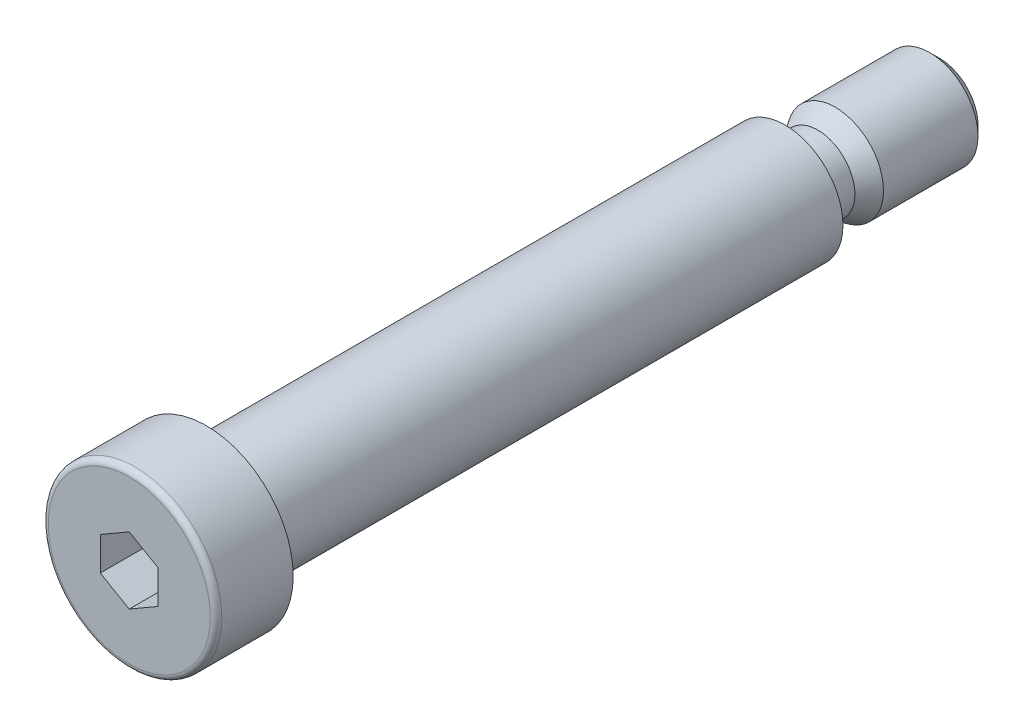
ISO-10303-21;
HEADER;
FILE_DESCRIPTION(('STEP AP214'),'2;1');
FILE_NAME('part.step','',(''),(''),'','','');
FILE_SCHEMA(('AUTOMOTIVE_DESIGN { 1 0 10303 214 1 1 1 1 }'));
ENDSEC;
DATA;
#1=APPLICATION_CONTEXT('core data for automotive mechanical design processes');
#2=APPLICATION_PROTOCOL_DEFINITION('international standard','automotive_design',2000,#1);
#3=PRODUCT_CONTEXT('',#1,'mechanical');
#4=PRODUCT('Part','Part','',(#3));
#5=PRODUCT_RELATED_PRODUCT_CATEGORY('part','',(#4));
#6=PRODUCT_DEFINITION_FORMATION('','',#4);
#7=PRODUCT_DEFINITION_CONTEXT('part definition',#1,'design');
#8=PRODUCT_DEFINITION('design','',#6,#7);
#9=PRODUCT_DEFINITION_SHAPE('','',#8);
#10=(LENGTH_UNIT() NAMED_UNIT(*) SI_UNIT(.MILLI.,.METRE.));
#11=(NAMED_UNIT(*) PLANE_ANGLE_UNIT() SI_UNIT($,.RADIAN.));
#12=(NAMED_UNIT(*) SI_UNIT($,.STERADIAN.) SOLID_ANGLE_UNIT());
#13=UNCERTAINTY_MEASURE_WITH_UNIT(LENGTH_MEASURE(1.E-05),#10,'distance_accuracy_value','');
#14=(GEOMETRIC_REPRESENTATION_CONTEXT(3) GLOBAL_UNCERTAINTY_ASSIGNED_CONTEXT((#13)) GLOBAL_UNIT_ASSIGNED_CONTEXT((#10,
#11,#12)) REPRESENTATION_CONTEXT('',''));
#15=CARTESIAN_POINT('',(0.,0.,0.));
#16=DIRECTION('',(0.,0.,1.));
#17=DIRECTION('',(1.,0.,0.));
#18=AXIS2_PLACEMENT_3D('',#15,#16,#17);
#19=CARTESIAN_POINT('',(0.,0.,38.));
#20=DIRECTION('',(0.,0.,1.));
#21=DIRECTION('',(1.,0.,0.));
#22=AXIS2_PLACEMENT_3D('',#19,#20,#21);
#23=PLANE('',#22);
#24=CARTESIAN_POINT('',(0.,0.,38.));
#25=DIRECTION('',(0.,0.,1.));
#26=DIRECTION('',(1.,0.,0.));
#27=AXIS2_PLACEMENT_3D('',#24,#25,#26);
#28=CIRCLE('',#27,8.4);
#29=CARTESIAN_POINT('',(8.4,0.,38.));
#30=VERTEX_POINT('',#29);
#31=EDGE_CURVE('E42',#30,#30,#28,.T.);
#32=ORIENTED_EDGE('',*,*,#31,.T.);
#33=EDGE_LOOP('',(#32));
#34=FACE_BOUND('',#33,.T.);
#35=DIRECTION('',(0.,1.,0.));
#36=VECTOR('',#35,1.);
#37=CARTESIAN_POINT('',(3.,-1.73205080756888,38.));
#38=LINE('',#37,#36);
#39=CARTESIAN_POINT('',(3.,-1.73205080756888,38.));
#40=VERTEX_POINT('',#39);
#41=CARTESIAN_POINT('',(3.,1.73205080756888,38.));
#42=VERTEX_POINT('',#41);
#43=EDGE_CURVE('E49',#40,#42,#38,.T.);
#44=ORIENTED_EDGE('',*,*,#43,.F.);
#45=DIRECTION('',(0.866025403784439,0.5,0.));
#46=VECTOR('',#45,1.);
#47=CARTESIAN_POINT('',(0.,-3.46410161513775,38.));
#48=LINE('',#47,#46);
#49=CARTESIAN_POINT('',(0.,-3.46410161513775,38.));
#50=VERTEX_POINT('',#49);
#51=EDGE_CURVE('E132',#50,#40,#48,.T.);
#52=ORIENTED_EDGE('',*,*,#51,.F.);
#53=DIRECTION('',(0.866025403784439,-0.5,0.));
#54=VECTOR('',#53,1.);
#55=CARTESIAN_POINT('',(-3.,-1.73205080756888,38.));
#56=LINE('',#55,#54);
#57=CARTESIAN_POINT('',(-3.,-1.73205080756888,38.));
#58=VERTEX_POINT('',#57);
#59=EDGE_CURVE('E130',#58,#50,#56,.T.);
#60=ORIENTED_EDGE('',*,*,#59,.F.);
#61=DIRECTION('',(0.,-1.,0.));
#62=VECTOR('',#61,1.);
#63=CARTESIAN_POINT('',(-3.,1.73205080756888,38.));
#64=LINE('',#63,#62);
#65=CARTESIAN_POINT('',(-3.,1.73205080756888,38.));
#66=VERTEX_POINT('',#65);
#67=EDGE_CURVE('E97',#66,#58,#64,.T.);
#68=ORIENTED_EDGE('',*,*,#67,.F.);
#69=DIRECTION('',(-0.866025403784439,-0.5,0.));
#70=VECTOR('',#69,1.);
#71=CARTESIAN_POINT('',(0.,3.46410161513775,38.));
#72=LINE('',#71,#70);
#73=CARTESIAN_POINT('',(0.,3.46410161513775,38.));
#74=VERTEX_POINT('',#73);
#75=EDGE_CURVE('E126',#74,#66,#72,.T.);
#76=ORIENTED_EDGE('',*,*,#75,.F.);
#77=DIRECTION('',(-0.866025403784439,0.5,0.));
#78=VECTOR('',#77,1.);
#79=CARTESIAN_POINT('',(3.,1.73205080756888,38.));
#80=LINE('',#79,#78);
#81=EDGE_CURVE('E123',#42,#74,#80,.T.);
#82=ORIENTED_EDGE('',*,*,#81,.F.);
#83=EDGE_LOOP('',(#44,#52,#60,#68,#76,#82));
#84=FACE_BOUND('',#83,.T.);
#85=ADVANCED_FACE('F34',(#34,#84),#23,.T.);
#86=CARTESIAN_POINT('',(0.,0.,-46.));
#87=DIRECTION('',(0.,0.,1.));
#88=DIRECTION('',(1.,0.,0.));
#89=AXIS2_PLACEMENT_3D('',#86,#87,#88);
#90=PLANE('',#89);
#91=CARTESIAN_POINT('',(0.,0.,-46.));
#92=DIRECTION('',(0.,0.,1.));
#93=DIRECTION('',(1.,0.,0.));
#94=AXIS2_PLACEMENT_3D('',#91,#92,#93);
#95=CIRCLE('',#94,4.);
#96=CARTESIAN_POINT('',(4.,0.,-46.));
#97=VERTEX_POINT('',#96);
#98=EDGE_CURVE('E162',#97,#97,#95,.T.);
#99=ORIENTED_EDGE('',*,*,#98,.F.);
#100=EDGE_LOOP('',(#99));
#101=FACE_BOUND('',#100,.T.);
#102=ADVANCED_FACE('F178',(#101),#90,.F.);
#103=CARTESIAN_POINT('',(0.,0.,-46.));
#104=DIRECTION('',(0.,0.,1.));
#105=DIRECTION('',(1.,0.,0.));
#106=AXIS2_PLACEMENT_3D('',#103,#104,#105);
#107=CONICAL_SURFACE('',#106,4.,0.785398163397447);
#108=CARTESIAN_POINT('',(0.,0.,-45.));
#109=DIRECTION('',(0.,0.,1.));
#110=DIRECTION('',(1.,0.,0.));
#111=AXIS2_PLACEMENT_3D('',#108,#109,#110);
#112=CIRCLE('',#111,5.);
#113=CARTESIAN_POINT('',(5.,0.,-45.));
#114=VERTEX_POINT('',#113);
#115=EDGE_CURVE('E159',#114,#114,#112,.T.);
#116=ORIENTED_EDGE('',*,*,#115,.F.);
#117=EDGE_LOOP('',(#116));
#118=FACE_BOUND('',#117,.T.);
#119=ORIENTED_EDGE('',*,*,#98,.T.);
#120=EDGE_LOOP('',(#119));
#121=FACE_BOUND('',#120,.T.);
#122=ADVANCED_FACE('F182',(#118,#121),#107,.T.);
#123=CARTESIAN_POINT('',(0.,0.,38.));
#124=DIRECTION('',(0.,0.,1.));
#125=DIRECTION('',(1.,0.,0.));
#126=AXIS2_PLACEMENT_3D('',#123,#124,#125);
#127=CYLINDRICAL_SURFACE('',#126,5.);
#128=CARTESIAN_POINT('',(0.,0.,-35.2));
#129=DIRECTION('',(0.,0.,1.));
#130=DIRECTION('',(1.,0.,0.));
#131=AXIS2_PLACEMENT_3D('',#128,#129,#130);
#132=CIRCLE('',#131,5.);
#133=CARTESIAN_POINT('',(5.,0.,-35.2));
#134=VERTEX_POINT('',#133);
#135=EDGE_CURVE('E156',#134,#134,#132,.T.);
#136=ORIENTED_EDGE('',*,*,#135,.F.);
#137=EDGE_LOOP('',(#136));
#138=FACE_BOUND('',#137,.T.);
#139=ORIENTED_EDGE('',*,*,#115,.T.);
#140=EDGE_LOOP('',(#139));
#141=FACE_BOUND('',#140,.T.);
#142=ADVANCED_FACE('F188',(#138,#141),#127,.T.);
#143=CARTESIAN_POINT('',(0.,0.,-35.2));
#144=DIRECTION('',(0.,0.,-1.));
#145=DIRECTION('',(-1.,0.,0.));
#146=AXIS2_PLACEMENT_3D('',#143,#144,#145);
#147=CONICAL_SURFACE('',#146,5.,0.56601391006324);
#148=CARTESIAN_POINT('',(0.,0.,-33.39));
#149=DIRECTION('',(0.,0.,1.));
#150=DIRECTION('',(1.,0.,0.));
#151=AXIS2_PLACEMENT_3D('',#148,#149,#150);
#152=CIRCLE('',#151,3.85000000000001);
#153=CARTESIAN_POINT('',(3.85000000000001,0.,-33.39));
#154=VERTEX_POINT('',#153);
#155=EDGE_CURVE('E153',#154,#154,#152,.T.);
#156=ORIENTED_EDGE('',*,*,#155,.F.);
#157=EDGE_LOOP('',(#156));
#158=FACE_BOUND('',#157,.T.);
#159=ORIENTED_EDGE('',*,*,#135,.T.);
#160=EDGE_LOOP('',(#159));
#161=FACE_BOUND('',#160,.T.);
#162=ADVANCED_FACE('F192',(#158,#161),#147,.T.);
#163=CARTESIAN_POINT('',(0.,0.,38.));
#164=DIRECTION('',(0.,0.,1.));
#165=DIRECTION('',(1.,0.,0.));
#166=AXIS2_PLACEMENT_3D('',#163,#164,#165);
#167=CYLINDRICAL_SURFACE('',#166,3.85000000000001);
#168=ORIENTED_EDGE('',*,*,#155,.T.);
#169=EDGE_LOOP('',(#168));
#170=FACE_BOUND('',#169,.T.);
#171=CARTESIAN_POINT('',(0.,0.,-30.));
#172=DIRECTION('',(0.,0.,1.));
#173=DIRECTION('',(1.,0.,0.));
#174=AXIS2_PLACEMENT_3D('',#171,#172,#173);
#175=CIRCLE('',#174,3.85000000000001);
#176=CARTESIAN_POINT('',(3.85000000000001,0.,-30.));
#177=VERTEX_POINT('',#176);
#178=EDGE_CURVE('E150',#177,#177,#175,.T.);
#179=ORIENTED_EDGE('',*,*,#178,.F.);
#180=EDGE_LOOP('',(#179));
#181=FACE_BOUND('',#180,.T.);
#182=ADVANCED_FACE('F196',(#170,#181),#167,.T.);
#183=CARTESIAN_POINT('',(0.,0.,-30.));
#184=DIRECTION('',(0.,0.,1.));
#185=DIRECTION('',(1.,0.,0.));
#186=AXIS2_PLACEMENT_3D('',#183,#184,#185);
#187=PLANE('',#186);
#188=CARTESIAN_POINT('',(0.,0.,-30.));
#189=DIRECTION('',(0.,0.,1.));
#190=DIRECTION('',(1.,0.,0.));
#191=AXIS2_PLACEMENT_3D('',#188,#189,#190);
#192=CIRCLE('',#191,6.);
#193=CARTESIAN_POINT('',(6.,0.,-30.));
#194=VERTEX_POINT('',#193);
#195=EDGE_CURVE('E147',#194,#194,#192,.T.);
#196=ORIENTED_EDGE('',*,*,#195,.F.);
#197=EDGE_LOOP('',(#196));
#198=FACE_BOUND('',#197,.T.);
#199=ORIENTED_EDGE('',*,*,#178,.T.);
#200=EDGE_LOOP('',(#199));
#201=FACE_BOUND('',#200,.T.);
#202=ADVANCED_FACE('F200',(#198,#201),#187,.F.);
#203=CARTESIAN_POINT('',(0.,0.,38.));
#204=DIRECTION('',(0.,0.,1.));
#205=DIRECTION('',(1.,0.,0.));
#206=AXIS2_PLACEMENT_3D('',#203,#204,#205);
#207=CYLINDRICAL_SURFACE('',#206,6.);
#208=ORIENTED_EDGE('',*,*,#195,.T.);
#209=EDGE_LOOP('',(#208));
#210=FACE_BOUND('',#209,.T.);
#211=CARTESIAN_POINT('',(0.,0.,30.));
#212=DIRECTION('',(0.,0.,1.));
#213=DIRECTION('',(1.,0.,0.));
#214=AXIS2_PLACEMENT_3D('',#211,#212,#213);
#215=CIRCLE('',#214,6.);
#216=CARTESIAN_POINT('',(6.,0.,30.));
#217=VERTEX_POINT('',#216);
#218=EDGE_CURVE('E144',#217,#217,#215,.T.);
#219=ORIENTED_EDGE('',*,*,#218,.F.);
#220=EDGE_LOOP('',(#219));
#221=FACE_BOUND('',#220,.T.);
#222=ADVANCED_FACE('F204',(#210,#221),#207,.T.);
#223=CARTESIAN_POINT('',(0.,0.,30.));
#224=DIRECTION('',(0.,0.,1.));
#225=DIRECTION('',(1.,0.,0.));
#226=AXIS2_PLACEMENT_3D('',#223,#224,#225);
#227=PLANE('',#226);
#228=CARTESIAN_POINT('',(0.,0.,30.));
#229=DIRECTION('',(0.,0.,1.));
#230=DIRECTION('',(1.,0.,0.));
#231=AXIS2_PLACEMENT_3D('',#228,#229,#230);
#232=CIRCLE('',#231,9.);
#233=CARTESIAN_POINT('',(9.,0.,30.));
#234=VERTEX_POINT('',#233);
#235=EDGE_CURVE('E136',#234,#234,#232,.T.);
#236=ORIENTED_EDGE('',*,*,#235,.F.);
#237=EDGE_LOOP('',(#236));
#238=FACE_BOUND('',#237,.T.);
#239=ORIENTED_EDGE('',*,*,#218,.T.);
#240=EDGE_LOOP('',(#239));
#241=FACE_BOUND('',#240,.T.);
#242=ADVANCED_FACE('F208',(#238,#241),#227,.F.);
#243=CARTESIAN_POINT('',(0.,0.,38.));
#244=DIRECTION('',(0.,0.,1.));
#245=DIRECTION('',(1.,0.,0.));
#246=AXIS2_PLACEMENT_3D('',#243,#244,#245);
#247=CYLINDRICAL_SURFACE('',#246,9.);
#248=CARTESIAN_POINT('',(0.,0.,37.4));
#249=DIRECTION('',(0.,0.,1.));
#250=DIRECTION('',(1.,0.,0.));
#251=AXIS2_PLACEMENT_3D('',#248,#249,#250);
#252=CIRCLE('',#251,9.);
#253=CARTESIAN_POINT('',(9.,0.,37.4));
#254=VERTEX_POINT('',#253);
#255=EDGE_CURVE('E11',#254,#254,#252,.F.);
#256=ORIENTED_EDGE('',*,*,#255,.T.);
#257=EDGE_LOOP('',(#256));
#258=FACE_BOUND('',#257,.T.);
#259=ORIENTED_EDGE('',*,*,#235,.T.);
#260=EDGE_LOOP('',(#259));
#261=FACE_BOUND('',#260,.T.);
#262=ADVANCED_FACE('F212',(#258,#261),#247,.T.);
#263=CARTESIAN_POINT('',(3.,-1.73205080756888,33.1));
#264=DIRECTION('',(1.,0.,0.));
#265=DIRECTION('',(0.,1.,0.));
#266=AXIS2_PLACEMENT_3D('',#263,#264,#265);
#267=PLANE('',#266);
#268=ORIENTED_EDGE('',*,*,#43,.T.);
#269=DIRECTION('',(0.,0.,1.));
#270=VECTOR('',#269,1.);
#271=CARTESIAN_POINT('',(3.,1.73205080756888,33.1));
#272=LINE('',#271,#270);
#273=CARTESIAN_POINT('',(3.,1.73205080756888,33.1));
#274=VERTEX_POINT('',#273);
#275=EDGE_CURVE('E79',#274,#42,#272,.T.);
#276=ORIENTED_EDGE('',*,*,#275,.F.);
#277=DIRECTION('',(0.,1.,0.));
#278=VECTOR('',#277,1.);
#279=CARTESIAN_POINT('',(3.,-1.73205080756888,33.1));
#280=LINE('',#279,#278);
#281=CARTESIAN_POINT('',(3.,-1.73205080756888,33.1));
#282=VERTEX_POINT('',#281);
#283=EDGE_CURVE('E134',#282,#274,#280,.T.);
#284=ORIENTED_EDGE('',*,*,#283,.F.);
#285=DIRECTION('',(0.,0.,1.));
#286=VECTOR('',#285,1.);
#287=CARTESIAN_POINT('',(3.,-1.73205080756888,33.1));
#288=LINE('',#287,#286);
#289=EDGE_CURVE('E57',#282,#40,#288,.T.);
#290=ORIENTED_EDGE('',*,*,#289,.T.);
#291=EDGE_LOOP('',(#268,#276,#284,#290));
#292=FACE_BOUND('',#291,.T.);
#293=ADVANCED_FACE('F216',(#292),#267,.F.);
#294=CARTESIAN_POINT('',(0.,-3.46410161513775,33.1));
#295=DIRECTION('',(0.5,-0.866025403784439,0.));
#296=DIRECTION('',(0.866025403784439,0.5,0.));
#297=AXIS2_PLACEMENT_3D('',#294,#295,#296);
#298=PLANE('',#297);
#299=ORIENTED_EDGE('',*,*,#51,.T.);
#300=ORIENTED_EDGE('',*,*,#289,.F.);
#301=DIRECTION('',(0.866025403784439,0.5,0.));
#302=VECTOR('',#301,1.);
#303=CARTESIAN_POINT('',(0.,-3.46410161513775,33.1));
#304=LINE('',#303,#302);
#305=CARTESIAN_POINT('',(0.,-3.46410161513775,33.1));
#306=VERTEX_POINT('',#305);
#307=EDGE_CURVE('E109',#306,#282,#304,.T.);
#308=ORIENTED_EDGE('',*,*,#307,.F.);
#309=DIRECTION('',(0.,0.,1.));
#310=VECTOR('',#309,1.);
#311=CARTESIAN_POINT('',(0.,-3.46410161513775,33.1));
#312=LINE('',#311,#310);
#313=EDGE_CURVE('E101',#306,#50,#312,.T.);
#314=ORIENTED_EDGE('',*,*,#313,.T.);
#315=EDGE_LOOP('',(#299,#300,#308,#314));
#316=FACE_BOUND('',#315,.T.);
#317=ADVANCED_FACE('F220',(#316),#298,.F.);
#318=CARTESIAN_POINT('',(-3.,-1.73205080756888,33.1));
#319=DIRECTION('',(-0.5,-0.866025403784439,0.));
#320=DIRECTION('',(0.866025403784439,-0.5,0.));
#321=AXIS2_PLACEMENT_3D('',#318,#319,#320);
#322=PLANE('',#321);
#323=ORIENTED_EDGE('',*,*,#59,.T.);
#324=ORIENTED_EDGE('',*,*,#313,.F.);
#325=DIRECTION('',(0.866025403784439,-0.5,0.));
#326=VECTOR('',#325,1.);
#327=CARTESIAN_POINT('',(-3.,-1.73205080756888,33.1));
#328=LINE('',#327,#326);
#329=CARTESIAN_POINT('',(-3.,-1.73205080756888,33.1));
#330=VERTEX_POINT('',#329);
#331=EDGE_CURVE('E105',#330,#306,#328,.T.);
#332=ORIENTED_EDGE('',*,*,#331,.F.);
#333=DIRECTION('',(0.,0.,1.));
#334=VECTOR('',#333,1.);
#335=CARTESIAN_POINT('',(-3.,-1.73205080756888,33.1));
#336=LINE('',#335,#334);
#337=EDGE_CURVE('E90',#330,#58,#336,.T.);
#338=ORIENTED_EDGE('',*,*,#337,.T.);
#339=EDGE_LOOP('',(#323,#324,#332,#338));
#340=FACE_BOUND('',#339,.T.);
#341=ADVANCED_FACE('F106',(#340),#322,.F.);
#342=CARTESIAN_POINT('',(-3.,1.73205080756888,33.1));
#343=DIRECTION('',(-1.,0.,0.));
#344=DIRECTION('',(0.,0.,1.));
#345=AXIS2_PLACEMENT_3D('',#342,#343,#344);
#346=PLANE('',#345);
#347=ORIENTED_EDGE('',*,*,#67,.T.);
#348=ORIENTED_EDGE('',*,*,#337,.F.);
#349=DIRECTION('',(0.,-1.,0.));
#350=VECTOR('',#349,1.);
#351=CARTESIAN_POINT('',(-3.,1.73205080756888,33.1));
#352=LINE('',#351,#350);
#353=CARTESIAN_POINT('',(-3.,1.73205080756888,33.1));
#354=VERTEX_POINT('',#353);
#355=EDGE_CURVE('E94',#354,#330,#352,.T.);
#356=ORIENTED_EDGE('',*,*,#355,.F.);
#357=DIRECTION('',(0.,0.,1.));
#358=VECTOR('',#357,1.);
#359=CARTESIAN_POINT('',(-3.,1.73205080756888,33.1));
#360=LINE('',#359,#358);
#361=EDGE_CURVE('E102',#354,#66,#360,.T.);
#362=ORIENTED_EDGE('',*,*,#361,.T.);
#363=EDGE_LOOP('',(#347,#348,#356,#362));
#364=FACE_BOUND('',#363,.T.);
#365=ADVANCED_FACE('F92',(#364),#346,.F.);
#366=CARTESIAN_POINT('',(0.,3.46410161513775,33.1));
#367=DIRECTION('',(-0.5,0.866025403784439,0.));
#368=DIRECTION('',(-0.866025403784439,-0.5,0.));
#369=AXIS2_PLACEMENT_3D('',#366,#367,#368);
#370=PLANE('',#369);
#371=ORIENTED_EDGE('',*,*,#75,.T.);
#372=ORIENTED_EDGE('',*,*,#361,.F.);
#373=DIRECTION('',(-0.866025403784439,-0.5,0.));
#374=VECTOR('',#373,1.);
#375=CARTESIAN_POINT('',(0.,3.46410161513775,33.1));
#376=LINE('',#375,#374);
#377=CARTESIAN_POINT('',(0.,3.46410161513775,33.1));
#378=VERTEX_POINT('',#377);
#379=EDGE_CURVE('E115',#378,#354,#376,.T.);
#380=ORIENTED_EDGE('',*,*,#379,.F.);
#381=DIRECTION('',(0.,0.,1.));
#382=VECTOR('',#381,1.);
#383=CARTESIAN_POINT('',(0.,3.46410161513775,33.1));
#384=LINE('',#383,#382);
#385=EDGE_CURVE('E139',#378,#74,#384,.T.);
#386=ORIENTED_EDGE('',*,*,#385,.T.);
#387=EDGE_LOOP('',(#371,#372,#380,#386));
#388=FACE_BOUND('',#387,.T.);
#389=ADVANCED_FACE('F223',(#388),#370,.F.);
#390=CARTESIAN_POINT('',(3.,1.73205080756888,33.1));
#391=DIRECTION('',(0.5,0.866025403784439,0.));
#392=DIRECTION('',(-0.866025403784439,0.5,0.));
#393=AXIS2_PLACEMENT_3D('',#390,#391,#392);
#394=PLANE('',#393);
#395=ORIENTED_EDGE('',*,*,#81,.T.);
#396=ORIENTED_EDGE('',*,*,#385,.F.);
#397=DIRECTION('',(-0.866025403784439,0.5,0.));
#398=VECTOR('',#397,1.);
#399=CARTESIAN_POINT('',(3.,1.73205080756888,33.1));
#400=LINE('',#399,#398);
#401=EDGE_CURVE('E117',#274,#378,#400,.T.);
#402=ORIENTED_EDGE('',*,*,#401,.F.);
#403=ORIENTED_EDGE('',*,*,#275,.T.);
#404=EDGE_LOOP('',(#395,#396,#402,#403));
#405=FACE_BOUND('',#404,.T.);
#406=ADVANCED_FACE('F174',(#405),#394,.F.);
#407=CARTESIAN_POINT('',(0.,0.,33.1));
#408=DIRECTION('',(0.,0.,1.));
#409=DIRECTION('',(1.,0.,0.));
#410=AXIS2_PLACEMENT_3D('',#407,#408,#409);
#411=PLANE('',#410);
#412=ORIENTED_EDGE('',*,*,#283,.T.);
#413=ORIENTED_EDGE('',*,*,#401,.T.);
#414=ORIENTED_EDGE('',*,*,#379,.T.);
#415=ORIENTED_EDGE('',*,*,#355,.T.);
#416=ORIENTED_EDGE('',*,*,#331,.T.);
#417=ORIENTED_EDGE('',*,*,#307,.T.);
#418=EDGE_LOOP('',(#412,#413,#414,#415,#416,#417));
#419=FACE_BOUND('',#418,.T.);
#420=ADVANCED_FACE('F112',(#419),#411,.T.);
#421=CARTESIAN_POINT('',(0.,0.,37.4));
#422=DIRECTION('',(0.,0.,1.));
#423=DIRECTION('',(1.,0.,0.));
#424=AXIS2_PLACEMENT_3D('',#421,#422,#423);
#425=TOROIDAL_SURFACE('',#424,8.4,0.6);
#426=ORIENTED_EDGE('',*,*,#255,.F.);
#427=EDGE_LOOP('',(#426));
#428=FACE_BOUND('',#427,.T.);
#429=ORIENTED_EDGE('',*,*,#31,.F.);
#430=EDGE_LOOP('',(#429));
#431=FACE_BOUND('',#430,.T.);
#432=ADVANCED_FACE('F36',(#428,#431),#425,.T.);
#433=CLOSED_SHELL('',(#85,#102,#122,#142,#162,#182,#202,#222,#242,#262,#293,#317,#341,#365,#389,
#406,#420,#432));
#434=MANIFOLD_SOLID_BREP('B2',#433);
#435=ADVANCED_BREP_SHAPE_REPRESENTATION('',(#18,#434),#14);
#436=SHAPE_DEFINITION_REPRESENTATION(#9,#435);
ENDSEC;
END-ISO-10303-21;
